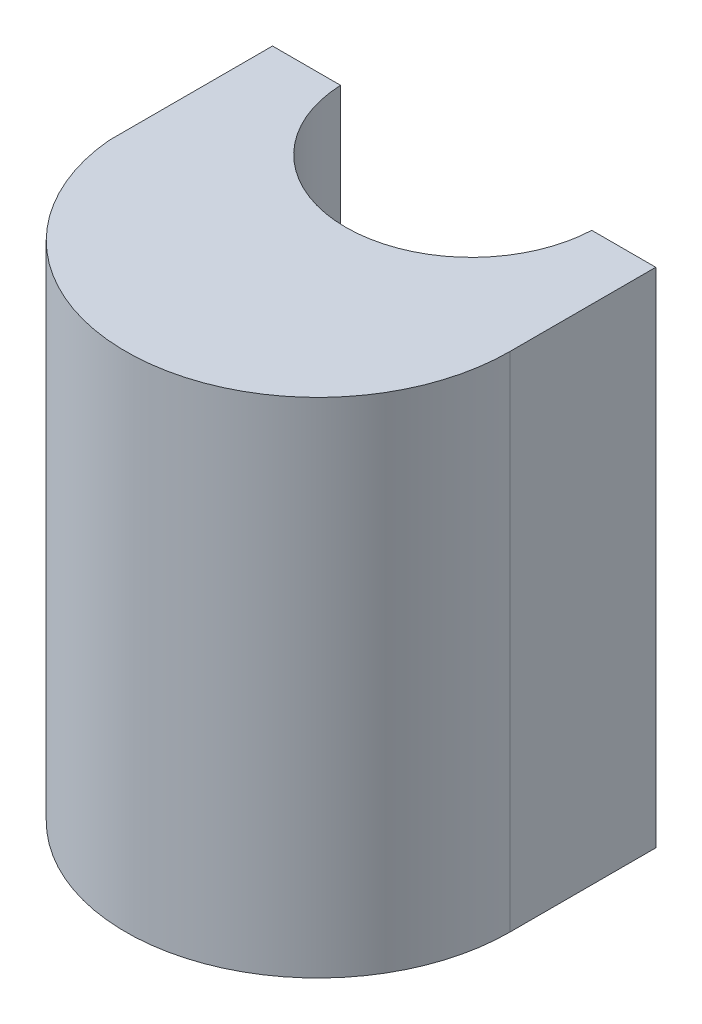
ISO-10303-21;
HEADER;
FILE_DESCRIPTION(('STEP AP214'),'2;1');
FILE_NAME('part.step','',(''),(''),'','','');
FILE_SCHEMA(('AUTOMOTIVE_DESIGN { 1 0 10303 214 1 1 1 1 }'));
ENDSEC;
DATA;
#1=APPLICATION_CONTEXT('core data for automotive mechanical design processes');
#2=APPLICATION_PROTOCOL_DEFINITION('international standard','automotive_design',2000,#1);
#3=PRODUCT_CONTEXT('',#1,'mechanical');
#4=PRODUCT('Part','Part','',(#3));
#5=PRODUCT_RELATED_PRODUCT_CATEGORY('part','',(#4));
#6=PRODUCT_DEFINITION_FORMATION('','',#4);
#7=PRODUCT_DEFINITION_CONTEXT('part definition',#1,'design');
#8=PRODUCT_DEFINITION('design','',#6,#7);
#9=PRODUCT_DEFINITION_SHAPE('','',#8);
#10=(LENGTH_UNIT() NAMED_UNIT(*) SI_UNIT(.MILLI.,.METRE.));
#11=(NAMED_UNIT(*) PLANE_ANGLE_UNIT() SI_UNIT($,.RADIAN.));
#12=(NAMED_UNIT(*) SI_UNIT($,.STERADIAN.) SOLID_ANGLE_UNIT());
#13=UNCERTAINTY_MEASURE_WITH_UNIT(LENGTH_MEASURE(1.E-05),#10,'distance_accuracy_value','');
#14=(GEOMETRIC_REPRESENTATION_CONTEXT(3) GLOBAL_UNCERTAINTY_ASSIGNED_CONTEXT((#13)) GLOBAL_UNIT_ASSIGNED_CONTEXT((#10,
#11,#12)) REPRESENTATION_CONTEXT('',''));
#15=CARTESIAN_POINT('',(0.,0.,0.));
#16=DIRECTION('',(0.,0.,1.));
#17=DIRECTION('',(1.,0.,0.));
#18=AXIS2_PLACEMENT_3D('',#15,#16,#17);
#19=CARTESIAN_POINT('',(1.26536763995208,2.87183105039429,15.5890947887312));
#20=DIRECTION('',(0.,1.,0.));
#21=DIRECTION('',(0.,0.,-1.));
#22=AXIS2_PLACEMENT_3D('',#19,#20,#21);
#23=PLANE('',#22);
#24=DIRECTION('',(-1.,0.,-2.19014998791785E-13));
#25=VECTOR('',#24,1.);
#26=CARTESIAN_POINT('',(4.68669451929166,2.87183105039428,6.70112871047519));
#27=LINE('',#26,#25);
#28=CARTESIAN_POINT('',(4.68669451929166,2.87183105039428,6.70112871047519));
#29=VERTEX_POINT('',#28);
#30=CARTESIAN_POINT('',(4.52431663596338,2.87183105039428,6.70112871047515));
#31=VERTEX_POINT('',#30);
#32=EDGE_CURVE('E116',#29,#31,#27,.T.);
#33=ORIENTED_EDGE('',*,*,#32,.T.);
#34=DIRECTION('',(2.31603663807447E-12,0.,-1.));
#35=VECTOR('',#34,1.);
#36=CARTESIAN_POINT('',(4.52431663596247,2.87183105039428,7.0923266892118));
#37=LINE('',#36,#35);
#38=CARTESIAN_POINT('',(4.52431663596247,2.87183105039428,7.0923266892118));
#39=VERTEX_POINT('',#38);
#40=EDGE_CURVE('E140',#39,#31,#37,.T.);
#41=ORIENTED_EDGE('',*,*,#40,.F.);
#42=CARTESIAN_POINT('',(4.9806100309463,2.87183105039428,7.04923878887403));
#43=DIRECTION('',(0.,1.,0.));
#44=DIRECTION('',(-0.995571061700838,0.,0.0940120263788917));
#45=AXIS2_PLACEMENT_3D('',#42,#43,#44);
#46=CIRCLE('',#45,0.458323280514298);
#47=CARTESIAN_POINT('',(5.43893331146059,2.87183105039428,7.04923878887417));
#48=VERTEX_POINT('',#47);
#49=EDGE_CURVE('E27',#39,#48,#46,.T.);
#50=ORIENTED_EDGE('',*,*,#49,.T.);
#51=DIRECTION('',(7.39892430869169E-12,0.,1.));
#52=VECTOR('',#51,1.);
#53=CARTESIAN_POINT('',(5.43893331145801,2.87183105039428,6.70112871047536));
#54=LINE('',#53,#52);
#55=CARTESIAN_POINT('',(5.43893331145801,2.87183105039428,6.70112871047536));
#56=VERTEX_POINT('',#55);
#57=EDGE_CURVE('E11',#56,#48,#54,.T.);
#58=ORIENTED_EDGE('',*,*,#57,.F.);
#59=DIRECTION('',(-1.,0.,-5.81579420434685E-13));
#60=VECTOR('',#59,1.);
#61=CARTESIAN_POINT('',(5.43893331145801,2.87183105039428,6.70112871047536));
#62=LINE('',#61,#60);
#63=CARTESIAN_POINT('',(5.28619870275186,2.87183105039428,6.70112871047527));
#64=VERTEX_POINT('',#63);
#65=EDGE_CURVE('E90',#56,#64,#62,.T.);
#66=ORIENTED_EDGE('',*,*,#65,.T.);
#67=CARTESIAN_POINT('',(4.98646763995184,2.87183105039428,6.68842871047528));
#68=DIRECTION('',(0.,1.,0.));
#69=DIRECTION('',(-0.999103542626009,0.,0.0423333333457055));
#70=AXIS2_PLACEMENT_3D('',#67,#68,#69);
#71=CIRCLE('',#70,0.299999999999993);
#72=CARTESIAN_POINT('',(4.98644661090241,2.87183105039428,6.98842870973826));
#73=VERTEX_POINT('',#72);
#74=EDGE_CURVE('E88',#73,#64,#71,.T.);
#75=ORIENTED_EDGE('',*,*,#74,.F.);
#76=CARTESIAN_POINT('',(4.98642558207964,2.87183105039428,6.68842871047528));
#77=DIRECTION('',(0.,1.,0.));
#78=DIRECTION('',(0.,0.,1.));
#79=AXIS2_PLACEMENT_3D('',#76,#77,#78);
#80=CIRCLE('',#79,0.299999999999994);
#81=EDGE_CURVE('E72',#29,#73,#80,.T.);
#82=ORIENTED_EDGE('',*,*,#81,.F.);
#83=EDGE_LOOP('',(#33,#41,#50,#58,#66,#75,#82));
#84=FACE_BOUND('',#83,.T.);
#85=ADVANCED_FACE('F17',(#84),#23,.T.);
#86=CARTESIAN_POINT('',(5.43893331145801,2.87183105039428,6.70112871047536));
#87=DIRECTION('',(1.,0.,-7.39892430869169E-12));
#88=DIRECTION('',(-7.39892430869169E-12,0.,-1.));
#89=AXIS2_PLACEMENT_3D('',#86,#87,#88);
#90=PLANE('',#89);
#91=DIRECTION('',(-7.39892430869169E-12,0.,-1.));
#92=VECTOR('',#91,1.);
#93=CARTESIAN_POINT('',(5.43893331149089,1.67183100556992,11.1451117495878));
#94=LINE('',#93,#92);
#95=CARTESIAN_POINT('',(5.4389333114606,1.67183100556992,7.04923878887417));
#96=VERTEX_POINT('',#95);
#97=CARTESIAN_POINT('',(5.43893331145802,1.67183100556992,6.70112871047536));
#98=VERTEX_POINT('',#97);
#99=EDGE_CURVE('E115',#96,#98,#94,.T.);
#100=ORIENTED_EDGE('',*,*,#99,.T.);
#101=DIRECTION('',(0.,-1.,0.));
#102=VECTOR('',#101,1.);
#103=CARTESIAN_POINT('',(5.43893331145801,2.87183105039428,6.70112871047536));
#104=LINE('',#103,#102);
#105=EDGE_CURVE('E101',#56,#98,#104,.T.);
#106=ORIENTED_EDGE('',*,*,#105,.F.);
#107=ORIENTED_EDGE('',*,*,#57,.T.);
#108=DIRECTION('',(0.,-1.,0.));
#109=VECTOR('',#108,1.);
#110=CARTESIAN_POINT('',(5.43893331146059,2.87183105039428,7.04923878887417));
#111=LINE('',#110,#109);
#112=EDGE_CURVE('E143',#48,#96,#111,.T.);
#113=ORIENTED_EDGE('',*,*,#112,.T.);
#114=EDGE_LOOP('',(#100,#106,#107,#113));
#115=FACE_BOUND('',#114,.T.);
#116=ADVANCED_FACE('F19',(#115),#90,.T.);
#117=CARTESIAN_POINT('',(4.9806100309463,2.87183105039428,7.04923878887403));
#118=DIRECTION('',(0.,-1.,0.));
#119=DIRECTION('',(-0.995571061700838,0.,0.0940120263788917));
#120=AXIS2_PLACEMENT_3D('',#117,#118,#119);
#121=CYLINDRICAL_SURFACE('',#120,0.458323280514298);
#122=CARTESIAN_POINT('',(4.9806100309463,1.67183100556992,7.04923878887403));
#123=DIRECTION('',(0.,1.,0.));
#124=DIRECTION('',(-0.995571061700838,0.,0.0940120263788917));
#125=AXIS2_PLACEMENT_3D('',#122,#123,#124);
#126=CIRCLE('',#125,0.458323280514298);
#127=CARTESIAN_POINT('',(4.52431663596248,1.67183100556992,7.0923266892118));
#128=VERTEX_POINT('',#127);
#129=EDGE_CURVE('E123',#128,#96,#126,.T.);
#130=ORIENTED_EDGE('',*,*,#129,.T.);
#131=ORIENTED_EDGE('',*,*,#112,.F.);
#132=ORIENTED_EDGE('',*,*,#49,.F.);
#133=DIRECTION('',(0.,-1.,0.));
#134=VECTOR('',#133,1.);
#135=CARTESIAN_POINT('',(4.52431663596247,2.87183105039428,7.0923266892118));
#136=LINE('',#135,#134);
#137=EDGE_CURVE('E119',#39,#128,#136,.T.);
#138=ORIENTED_EDGE('',*,*,#137,.T.);
#139=EDGE_LOOP('',(#130,#131,#132,#138));
#140=FACE_BOUND('',#139,.T.);
#141=ADVANCED_FACE('F289',(#140),#121,.T.);
#142=CARTESIAN_POINT('',(4.52431663596247,2.87183105039428,7.0923266892118));
#143=DIRECTION('',(-1.,0.,-2.31603663807447E-12));
#144=DIRECTION('',(-2.31603663807447E-12,0.,1.));
#145=AXIS2_PLACEMENT_3D('',#142,#143,#144);
#146=PLANE('',#145);
#147=DIRECTION('',(-2.31603663807447E-12,0.,1.));
#148=VECTOR('',#147,1.);
#149=CARTESIAN_POINT('',(4.52431663595263,1.67183100556992,11.3407107389753));
#150=LINE('',#149,#148);
#151=CARTESIAN_POINT('',(4.52431663596339,1.67183100556992,6.70112871047515));
#152=VERTEX_POINT('',#151);
#153=EDGE_CURVE('E124',#152,#128,#150,.T.);
#154=ORIENTED_EDGE('',*,*,#153,.T.);
#155=ORIENTED_EDGE('',*,*,#137,.F.);
#156=ORIENTED_EDGE('',*,*,#40,.T.);
#157=DIRECTION('',(0.,-1.,0.));
#158=VECTOR('',#157,1.);
#159=CARTESIAN_POINT('',(4.52431663596338,2.87183105039428,6.70112871047515));
#160=LINE('',#159,#158);
#161=EDGE_CURVE('E85',#31,#152,#160,.T.);
#162=ORIENTED_EDGE('',*,*,#161,.T.);
#163=EDGE_LOOP('',(#154,#155,#156,#162));
#164=FACE_BOUND('',#163,.T.);
#165=ADVANCED_FACE('F281',(#164),#146,.T.);
#166=CARTESIAN_POINT('',(4.52431663596338,2.87183105039428,6.70112871047515));
#167=DIRECTION('',(2.19014998791785E-13,0.,-1.));
#168=DIRECTION('',(0.,-1.,0.));
#169=AXIS2_PLACEMENT_3D('',#166,#167,#168);
#170=PLANE('',#169);
#171=DIRECTION('',(-1.,0.,-2.19014998791785E-13));
#172=VECTOR('',#171,1.);
#173=CARTESIAN_POINT('',(2.89484213795871,1.67183100556992,6.70112871047479));
#174=LINE('',#173,#172);
#175=CARTESIAN_POINT('',(4.68669451929167,1.67183100556992,6.70112871047519));
#176=VERTEX_POINT('',#175);
#177=EDGE_CURVE('E157',#176,#152,#174,.T.);
#178=ORIENTED_EDGE('',*,*,#177,.T.);
#179=ORIENTED_EDGE('',*,*,#161,.F.);
#180=ORIENTED_EDGE('',*,*,#32,.F.);
#181=DIRECTION('',(0.,-1.,0.));
#182=VECTOR('',#181,1.);
#183=CARTESIAN_POINT('',(4.68669451929166,2.87183105039428,6.70112871047519));
#184=LINE('',#183,#182);
#185=EDGE_CURVE('E81',#29,#176,#184,.T.);
#186=ORIENTED_EDGE('',*,*,#185,.T.);
#187=EDGE_LOOP('',(#178,#179,#180,#186));
#188=FACE_BOUND('',#187,.T.);
#189=ADVANCED_FACE('F168',(#188),#170,.T.);
#190=CARTESIAN_POINT('',(4.98642558207964,2.87183105039428,6.68842871047528));
#191=DIRECTION('',(0.,-1.,0.));
#192=DIRECTION('',(0.,0.,1.));
#193=AXIS2_PLACEMENT_3D('',#190,#191,#192);
#194=CYLINDRICAL_SURFACE('',#193,0.299999999999994);
#195=CARTESIAN_POINT('',(4.98642558207964,1.67183100556992,6.68842871047528));
#196=DIRECTION('',(0.,-1.,0.));
#197=DIRECTION('',(0.,0.,1.));
#198=AXIS2_PLACEMENT_3D('',#195,#196,#197);
#199=CIRCLE('',#198,0.299999999999994);
#200=CARTESIAN_POINT('',(4.98644661090242,1.67183100556992,6.98842870973826));
#201=VERTEX_POINT('',#200);
#202=EDGE_CURVE('E154',#201,#176,#199,.T.);
#203=ORIENTED_EDGE('',*,*,#202,.T.);
#204=ORIENTED_EDGE('',*,*,#185,.F.);
#205=ORIENTED_EDGE('',*,*,#81,.T.);
#206=DIRECTION('',(0.,-1.,0.));
#207=VECTOR('',#206,1.);
#208=CARTESIAN_POINT('',(4.98644661090241,2.87183105039428,6.98842870973826));
#209=LINE('',#208,#207);
#210=EDGE_CURVE('E78',#73,#201,#209,.T.);
#211=ORIENTED_EDGE('',*,*,#210,.T.);
#212=EDGE_LOOP('',(#203,#204,#205,#211));
#213=FACE_BOUND('',#212,.T.);
#214=ADVANCED_FACE('F75',(#213),#194,.F.);
#215=CARTESIAN_POINT('',(4.98646763995184,2.87183105039428,6.68842871047528));
#216=DIRECTION('',(0.,-1.,0.));
#217=DIRECTION('',(-0.999103542626009,0.,0.0423333333457054));
#218=AXIS2_PLACEMENT_3D('',#215,#216,#217);
#219=CYLINDRICAL_SURFACE('',#218,0.299999999999993);
#220=CARTESIAN_POINT('',(4.98646763995184,1.67183100556992,6.68842871047528));
#221=DIRECTION('',(0.,-1.,0.));
#222=DIRECTION('',(-0.999103542626009,0.,0.0423333333457055));
#223=AXIS2_PLACEMENT_3D('',#220,#221,#222);
#224=CIRCLE('',#223,0.299999999999993);
#225=CARTESIAN_POINT('',(5.28619870275187,1.67183100556992,6.70112871047527));
#226=VERTEX_POINT('',#225);
#227=EDGE_CURVE('E98',#226,#201,#224,.T.);
#228=ORIENTED_EDGE('',*,*,#227,.T.);
#229=ORIENTED_EDGE('',*,*,#210,.F.);
#230=ORIENTED_EDGE('',*,*,#74,.T.);
#231=DIRECTION('',(0.,-1.,0.));
#232=VECTOR('',#231,1.);
#233=CARTESIAN_POINT('',(5.28619870275186,2.87183105039428,6.70112871047527));
#234=LINE('',#233,#232);
#235=EDGE_CURVE('E128',#64,#226,#234,.T.);
#236=ORIENTED_EDGE('',*,*,#235,.T.);
#237=EDGE_LOOP('',(#228,#229,#230,#236));
#238=FACE_BOUND('',#237,.T.);
#239=ADVANCED_FACE('F96',(#238),#219,.F.);
#240=CARTESIAN_POINT('',(5.28619870275186,2.87183105039428,6.70112871047527));
#241=DIRECTION('',(5.81579420434685E-13,0.,-1.));
#242=DIRECTION('',(0.,-1.,0.));
#243=AXIS2_PLACEMENT_3D('',#240,#241,#242);
#244=PLANE('',#243);
#245=DIRECTION('',(-1.,0.,-5.81579420434685E-13));
#246=VECTOR('',#245,1.);
#247=CARTESIAN_POINT('',(3.27578317135456,1.67183100556992,6.70112871047411));
#248=LINE('',#247,#246);
#249=EDGE_CURVE('E111',#98,#226,#248,.T.);
#250=ORIENTED_EDGE('',*,*,#249,.T.);
#251=ORIENTED_EDGE('',*,*,#235,.F.);
#252=ORIENTED_EDGE('',*,*,#65,.F.);
#253=ORIENTED_EDGE('',*,*,#105,.T.);
#254=EDGE_LOOP('',(#250,#251,#252,#253));
#255=FACE_BOUND('',#254,.T.);
#256=ADVANCED_FACE('F191',(#255),#244,.T.);
#257=CARTESIAN_POINT('',(1.26536763995209,1.67183100556992,15.5890947887312));
#258=DIRECTION('',(0.,1.,0.));
#259=DIRECTION('',(0.,0.,-1.));
#260=AXIS2_PLACEMENT_3D('',#257,#258,#259);
#261=PLANE('',#260);
#262=ORIENTED_EDGE('',*,*,#177,.F.);
#263=ORIENTED_EDGE('',*,*,#202,.F.);
#264=ORIENTED_EDGE('',*,*,#227,.F.);
#265=ORIENTED_EDGE('',*,*,#249,.F.);
#266=ORIENTED_EDGE('',*,*,#99,.F.);
#267=ORIENTED_EDGE('',*,*,#129,.F.);
#268=ORIENTED_EDGE('',*,*,#153,.F.);
#269=EDGE_LOOP('',(#262,#263,#264,#265,#266,#267,#268));
#270=FACE_BOUND('',#269,.T.);
#271=ADVANCED_FACE('F174',(#270),#261,.F.);
#272=CLOSED_SHELL('',(#85,#116,#141,#165,#189,#214,#239,#256,#271));
#273=MANIFOLD_SOLID_BREP('B1',#272);
#274=ADVANCED_BREP_SHAPE_REPRESENTATION('',(#18,#273),#14);
#275=SHAPE_DEFINITION_REPRESENTATION(#9,#274);
ENDSEC;
END-ISO-10303-21;
